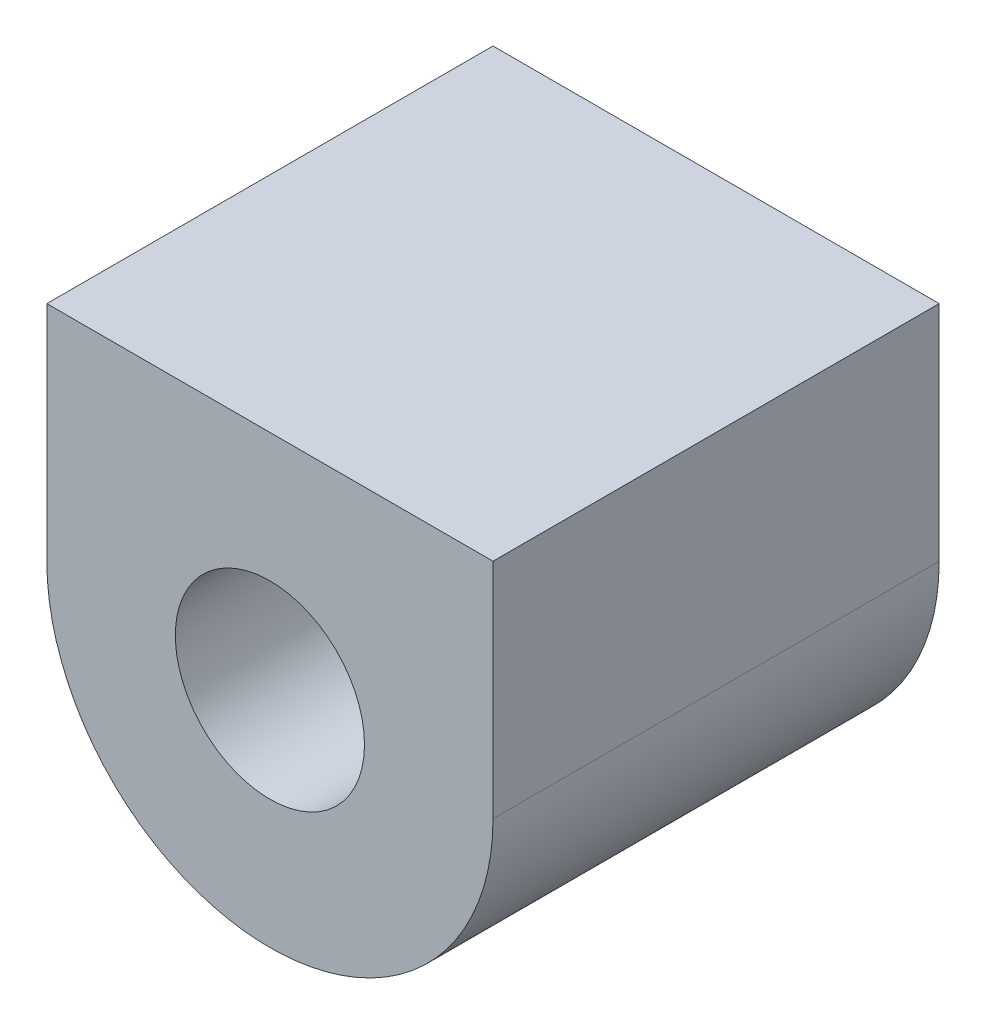
ISO-10303-21;
HEADER;
FILE_DESCRIPTION(('STEP AP214'),'2;1');
FILE_NAME('part.step','',(''),(''),'','','');
FILE_SCHEMA(('AUTOMOTIVE_DESIGN { 1 0 10303 214 1 1 1 1 }'));
ENDSEC;
DATA;
#1=APPLICATION_CONTEXT('core data for automotive mechanical design processes');
#2=APPLICATION_PROTOCOL_DEFINITION('international standard','automotive_design',2000,#1);
#3=PRODUCT_CONTEXT('',#1,'mechanical');
#4=PRODUCT('Part','Part','',(#3));
#5=PRODUCT_RELATED_PRODUCT_CATEGORY('part','',(#4));
#6=PRODUCT_DEFINITION_FORMATION('','',#4);
#7=PRODUCT_DEFINITION_CONTEXT('part definition',#1,'design');
#8=PRODUCT_DEFINITION('design','',#6,#7);
#9=PRODUCT_DEFINITION_SHAPE('','',#8);
#10=(LENGTH_UNIT() NAMED_UNIT(*) SI_UNIT(.MILLI.,.METRE.));
#11=(NAMED_UNIT(*) PLANE_ANGLE_UNIT() SI_UNIT($,.RADIAN.));
#12=(NAMED_UNIT(*) SI_UNIT($,.STERADIAN.) SOLID_ANGLE_UNIT());
#13=UNCERTAINTY_MEASURE_WITH_UNIT(LENGTH_MEASURE(1.E-05),#10,'distance_accuracy_value','');
#14=(GEOMETRIC_REPRESENTATION_CONTEXT(3) GLOBAL_UNCERTAINTY_ASSIGNED_CONTEXT((#13)) GLOBAL_UNIT_ASSIGNED_CONTEXT((#10,
#11,#12)) REPRESENTATION_CONTEXT('',''));
#15=CARTESIAN_POINT('',(0.,0.,0.));
#16=DIRECTION('',(0.,0.,1.));
#17=DIRECTION('',(1.,0.,0.));
#18=AXIS2_PLACEMENT_3D('',#15,#16,#17);
#19=CARTESIAN_POINT('',(0.,12.5,-12.5));
#20=DIRECTION('',(0.,0.,1.));
#21=DIRECTION('',(1.,0.,0.));
#22=AXIS2_PLACEMENT_3D('',#19,#20,#21);
#23=CYLINDRICAL_SURFACE('',#22,12.5);
#24=DIRECTION('',(0.,0.,-1.));
#25=VECTOR('',#24,1.);
#26=CARTESIAN_POINT('',(-12.5,12.5,-12.5));
#27=LINE('',#26,#25);
#28=CARTESIAN_POINT('',(-12.5,12.5,-12.5));
#29=VERTEX_POINT('',#28);
#30=CARTESIAN_POINT('',(-12.5,12.5,12.5));
#31=VERTEX_POINT('',#30);
#32=EDGE_CURVE('E112',#29,#31,#27,.F.);
#33=ORIENTED_EDGE('',*,*,#32,.F.);
#34=CARTESIAN_POINT('',(0.,12.5,-12.5));
#35=DIRECTION('',(0.,0.,1.));
#36=DIRECTION('',(1.,0.,0.));
#37=AXIS2_PLACEMENT_3D('',#34,#35,#36);
#38=CIRCLE('',#37,12.5);
#39=CARTESIAN_POINT('',(12.5,12.5,-12.5));
#40=VERTEX_POINT('',#39);
#41=EDGE_CURVE('E56',#40,#29,#38,.F.);
#42=ORIENTED_EDGE('',*,*,#41,.F.);
#43=DIRECTION('',(0.,0.,-1.));
#44=VECTOR('',#43,1.);
#45=CARTESIAN_POINT('',(12.5,12.5,-12.5));
#46=LINE('',#45,#44);
#47=CARTESIAN_POINT('',(12.5,12.5,12.5));
#48=VERTEX_POINT('',#47);
#49=EDGE_CURVE('E110',#48,#40,#46,.T.);
#50=ORIENTED_EDGE('',*,*,#49,.F.);
#51=CARTESIAN_POINT('',(0.,12.5,12.5));
#52=DIRECTION('',(0.,0.,-1.));
#53=DIRECTION('',(-1.,0.,0.));
#54=AXIS2_PLACEMENT_3D('',#51,#52,#53);
#55=CIRCLE('',#54,12.5);
#56=EDGE_CURVE('E11',#31,#48,#55,.F.);
#57=ORIENTED_EDGE('',*,*,#56,.F.);
#58=EDGE_LOOP('',(#33,#42,#50,#57));
#59=FACE_BOUND('',#58,.T.);
#60=ADVANCED_FACE('F47',(#59),#23,.T.);
#61=CARTESIAN_POINT('',(12.5,25.,12.5));
#62=DIRECTION('',(-1.,0.,0.));
#63=DIRECTION('',(0.,0.,1.));
#64=AXIS2_PLACEMENT_3D('',#61,#62,#63);
#65=PLANE('',#64);
#66=DIRECTION('',(0.,-1.,0.));
#67=VECTOR('',#66,1.);
#68=CARTESIAN_POINT('',(12.5,25.,12.5));
#69=LINE('',#68,#67);
#70=CARTESIAN_POINT('',(12.5,25.,12.5));
#71=VERTEX_POINT('',#70);
#72=EDGE_CURVE('E130',#71,#48,#69,.T.);
#73=ORIENTED_EDGE('',*,*,#72,.T.);
#74=ORIENTED_EDGE('',*,*,#49,.T.);
#75=DIRECTION('',(0.,-1.,0.));
#76=VECTOR('',#75,1.);
#77=CARTESIAN_POINT('',(12.5,25.,-12.5));
#78=LINE('',#77,#76);
#79=CARTESIAN_POINT('',(12.5,25.,-12.5));
#80=VERTEX_POINT('',#79);
#81=EDGE_CURVE('E91',#80,#40,#78,.T.);
#82=ORIENTED_EDGE('',*,*,#81,.F.);
#83=DIRECTION('',(0.,0.,-1.));
#84=VECTOR('',#83,1.);
#85=CARTESIAN_POINT('',(12.5,25.,12.5));
#86=LINE('',#85,#84);
#87=EDGE_CURVE('E98',#71,#80,#86,.T.);
#88=ORIENTED_EDGE('',*,*,#87,.F.);
#89=EDGE_LOOP('',(#73,#74,#82,#88));
#90=FACE_BOUND('',#89,.T.);
#91=ADVANCED_FACE('F109',(#90),#65,.F.);
#92=CARTESIAN_POINT('',(-12.5,25.,-12.5));
#93=DIRECTION('',(0.,0.,1.));
#94=DIRECTION('',(1.,0.,0.));
#95=AXIS2_PLACEMENT_3D('',#92,#93,#94);
#96=PLANE('',#95);
#97=CARTESIAN_POINT('',(0.,12.5,-12.5));
#98=DIRECTION('',(0.,0.,1.));
#99=DIRECTION('',(1.,0.,0.));
#100=AXIS2_PLACEMENT_3D('',#97,#98,#99);
#101=CIRCLE('',#100,5.3);
#102=CARTESIAN_POINT('',(5.3,12.5,-12.5));
#103=VERTEX_POINT('',#102);
#104=EDGE_CURVE('E107',#103,#103,#101,.T.);
#105=ORIENTED_EDGE('',*,*,#104,.T.);
#106=EDGE_LOOP('',(#105));
#107=FACE_BOUND('',#106,.T.);
#108=ORIENTED_EDGE('',*,*,#81,.T.);
#109=ORIENTED_EDGE('',*,*,#41,.T.);
#110=DIRECTION('',(0.,-1.,0.));
#111=VECTOR('',#110,1.);
#112=CARTESIAN_POINT('',(-12.5,25.,-12.5));
#113=LINE('',#112,#111);
#114=CARTESIAN_POINT('',(-12.5,25.,-12.5));
#115=VERTEX_POINT('',#114);
#116=EDGE_CURVE('E93',#115,#29,#113,.T.);
#117=ORIENTED_EDGE('',*,*,#116,.F.);
#118=DIRECTION('',(-1.,0.,0.));
#119=VECTOR('',#118,1.);
#120=CARTESIAN_POINT('',(-12.5,25.,-12.5));
#121=LINE('',#120,#119);
#122=EDGE_CURVE('E87',#80,#115,#121,.T.);
#123=ORIENTED_EDGE('',*,*,#122,.F.);
#124=EDGE_LOOP('',(#108,#109,#117,#123));
#125=FACE_BOUND('',#124,.T.);
#126=ADVANCED_FACE('F89',(#107,#125),#96,.F.);
#127=CARTESIAN_POINT('',(-12.5,25.,12.5));
#128=DIRECTION('',(1.,0.,0.));
#129=DIRECTION('',(0.,0.,-1.));
#130=AXIS2_PLACEMENT_3D('',#127,#128,#129);
#131=PLANE('',#130);
#132=ORIENTED_EDGE('',*,*,#116,.T.);
#133=ORIENTED_EDGE('',*,*,#32,.T.);
#134=DIRECTION('',(0.,-1.,0.));
#135=VECTOR('',#134,1.);
#136=CARTESIAN_POINT('',(-12.5,25.,12.5));
#137=LINE('',#136,#135);
#138=CARTESIAN_POINT('',(-12.5,25.,12.5));
#139=VERTEX_POINT('',#138);
#140=EDGE_CURVE('E118',#139,#31,#137,.T.);
#141=ORIENTED_EDGE('',*,*,#140,.F.);
#142=DIRECTION('',(0.,0.,1.));
#143=VECTOR('',#142,1.);
#144=CARTESIAN_POINT('',(-12.5,25.,12.5));
#145=LINE('',#144,#143);
#146=EDGE_CURVE('E97',#115,#139,#145,.T.);
#147=ORIENTED_EDGE('',*,*,#146,.F.);
#148=EDGE_LOOP('',(#132,#133,#141,#147));
#149=FACE_BOUND('',#148,.T.);
#150=ADVANCED_FACE('F126',(#149),#131,.F.);
#151=CARTESIAN_POINT('',(-12.5,25.,12.5));
#152=DIRECTION('',(0.,0.,-1.));
#153=DIRECTION('',(-1.,0.,0.));
#154=AXIS2_PLACEMENT_3D('',#151,#152,#153);
#155=PLANE('',#154);
#156=CARTESIAN_POINT('',(0.,12.5,12.5));
#157=DIRECTION('',(0.,0.,1.));
#158=DIRECTION('',(1.,0.,0.));
#159=AXIS2_PLACEMENT_3D('',#156,#157,#158);
#160=CIRCLE('',#159,5.3);
#161=CARTESIAN_POINT('',(5.3,12.5,12.5));
#162=VERTEX_POINT('',#161);
#163=EDGE_CURVE('E163',#162,#162,#160,.T.);
#164=ORIENTED_EDGE('',*,*,#163,.F.);
#165=EDGE_LOOP('',(#164));
#166=FACE_BOUND('',#165,.T.);
#167=ORIENTED_EDGE('',*,*,#140,.T.);
#168=ORIENTED_EDGE('',*,*,#56,.T.);
#169=ORIENTED_EDGE('',*,*,#72,.F.);
#170=DIRECTION('',(1.,0.,0.));
#171=VECTOR('',#170,1.);
#172=CARTESIAN_POINT('',(-12.5,25.,12.5));
#173=LINE('',#172,#171);
#174=EDGE_CURVE('E103',#139,#71,#173,.T.);
#175=ORIENTED_EDGE('',*,*,#174,.F.);
#176=EDGE_LOOP('',(#167,#168,#169,#175));
#177=FACE_BOUND('',#176,.T.);
#178=ADVANCED_FACE('F135',(#166,#177),#155,.F.);
#179=CARTESIAN_POINT('',(0.,25.,0.));
#180=DIRECTION('',(0.,-1.,0.));
#181=DIRECTION('',(0.,0.,-1.));
#182=AXIS2_PLACEMENT_3D('',#179,#180,#181);
#183=PLANE('',#182);
#184=ORIENTED_EDGE('',*,*,#87,.T.);
#185=ORIENTED_EDGE('',*,*,#122,.T.);
#186=ORIENTED_EDGE('',*,*,#146,.T.);
#187=ORIENTED_EDGE('',*,*,#174,.T.);
#188=EDGE_LOOP('',(#184,#185,#186,#187));
#189=FACE_BOUND('',#188,.T.);
#190=ADVANCED_FACE('F101',(#189),#183,.F.);
#191=CARTESIAN_POINT('',(0.,12.5,-12.5));
#192=DIRECTION('',(0.,0.,1.));
#193=DIRECTION('',(1.,0.,0.));
#194=AXIS2_PLACEMENT_3D('',#191,#192,#193);
#195=CYLINDRICAL_SURFACE('',#194,5.3);
#196=ORIENTED_EDGE('',*,*,#104,.F.);
#197=EDGE_LOOP('',(#196));
#198=FACE_BOUND('',#197,.T.);
#199=ORIENTED_EDGE('',*,*,#163,.T.);
#200=EDGE_LOOP('',(#199));
#201=FACE_BOUND('',#200,.T.);
#202=ADVANCED_FACE('F143',(#198,#201),#195,.F.);
#203=CLOSED_SHELL('',(#60,#91,#126,#150,#178,#190,#202));
#204=MANIFOLD_SOLID_BREP('B2',#203);
#205=ADVANCED_BREP_SHAPE_REPRESENTATION('',(#18,#204),#14);
#206=SHAPE_DEFINITION_REPRESENTATION(#9,#205);
ENDSEC;
END-ISO-10303-21;
